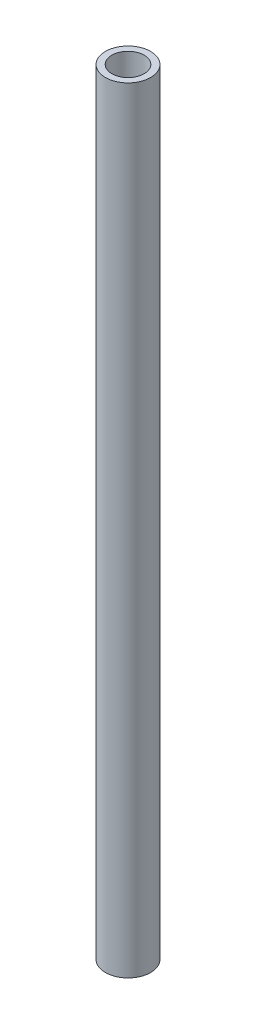
ISO-10303-21;
HEADER;
FILE_DESCRIPTION(('STEP AP214'),'2;1');
FILE_NAME('part.step','',(''),(''),'','','');
FILE_SCHEMA(('AUTOMOTIVE_DESIGN { 1 0 10303 214 1 1 1 1 }'));
ENDSEC;
DATA;
#1=APPLICATION_CONTEXT('core data for automotive mechanical design processes');
#2=APPLICATION_PROTOCOL_DEFINITION('international standard','automotive_design',2000,#1);
#3=PRODUCT_CONTEXT('',#1,'mechanical');
#4=PRODUCT('Part','Part','',(#3));
#5=PRODUCT_RELATED_PRODUCT_CATEGORY('part','',(#4));
#6=PRODUCT_DEFINITION_FORMATION('','',#4);
#7=PRODUCT_DEFINITION_CONTEXT('part definition',#1,'design');
#8=PRODUCT_DEFINITION('design','',#6,#7);
#9=PRODUCT_DEFINITION_SHAPE('','',#8);
#10=(LENGTH_UNIT() NAMED_UNIT(*) SI_UNIT(.MILLI.,.METRE.));
#11=(NAMED_UNIT(*) PLANE_ANGLE_UNIT() SI_UNIT($,.RADIAN.));
#12=(NAMED_UNIT(*) SI_UNIT($,.STERADIAN.) SOLID_ANGLE_UNIT());
#13=UNCERTAINTY_MEASURE_WITH_UNIT(LENGTH_MEASURE(1.E-05),#10,'distance_accuracy_value','');
#14=(GEOMETRIC_REPRESENTATION_CONTEXT(3) GLOBAL_UNCERTAINTY_ASSIGNED_CONTEXT((#13)) GLOBAL_UNIT_ASSIGNED_CONTEXT((#10,
#11,#12)) REPRESENTATION_CONTEXT('',''));
#15=CARTESIAN_POINT('',(0.,0.,0.));
#16=DIRECTION('',(0.,0.,1.));
#17=DIRECTION('',(1.,0.,0.));
#18=AXIS2_PLACEMENT_3D('',#15,#16,#17);
#19=CARTESIAN_POINT('',(2.50000000000002,60.,0.));
#20=DIRECTION('',(0.,1.,0.));
#21=DIRECTION('',(0.,0.,1.));
#22=AXIS2_PLACEMENT_3D('',#19,#20,#21);
#23=PLANE('',#22);
#24=CARTESIAN_POINT('',(0.,60.,0.));
#25=DIRECTION('',(0.,-1.,0.));
#26=DIRECTION('',(0.,0.,-1.));
#27=AXIS2_PLACEMENT_3D('',#24,#25,#26);
#28=CIRCLE('',#27,2.50000000000002);
#29=CARTESIAN_POINT('',(0.,60.,-2.50000000000002));
#30=VERTEX_POINT('',#29);
#31=EDGE_CURVE('E55',#30,#30,#28,.T.);
#32=ORIENTED_EDGE('',*,*,#31,.T.);
#33=EDGE_LOOP('',(#32));
#34=FACE_BOUND('',#33,.T.);
#35=CARTESIAN_POINT('',(0.,60.,0.));
#36=DIRECTION('',(0.,-1.,0.));
#37=DIRECTION('',(0.,0.,-1.));
#38=AXIS2_PLACEMENT_3D('',#35,#36,#37);
#39=CIRCLE('',#38,3.50000000000002);
#40=CARTESIAN_POINT('',(0.,60.,-3.50000000000002));
#41=VERTEX_POINT('',#40);
#42=EDGE_CURVE('E12',#41,#41,#39,.T.);
#43=ORIENTED_EDGE('',*,*,#42,.F.);
#44=EDGE_LOOP('',(#43));
#45=FACE_BOUND('',#44,.T.);
#46=ADVANCED_FACE('F41',(#34,#45),#23,.T.);
#47=CARTESIAN_POINT('',(0.,-84.5864661654135,0.));
#48=DIRECTION('',(0.,-1.,0.));
#49=DIRECTION('',(0.,0.,-1.));
#50=AXIS2_PLACEMENT_3D('',#47,#48,#49);
#51=CYLINDRICAL_SURFACE('',#50,3.50000000000002);
#52=ORIENTED_EDGE('',*,*,#42,.T.);
#53=EDGE_LOOP('',(#52));
#54=FACE_BOUND('',#53,.T.);
#55=CARTESIAN_POINT('',(0.,-60.,0.));
#56=DIRECTION('',(0.,-1.,0.));
#57=DIRECTION('',(0.,0.,-1.));
#58=AXIS2_PLACEMENT_3D('',#55,#56,#57);
#59=CIRCLE('',#58,3.50000000000002);
#60=CARTESIAN_POINT('',(0.,-60.,-3.50000000000002));
#61=VERTEX_POINT('',#60);
#62=EDGE_CURVE('E47',#61,#61,#59,.T.);
#63=ORIENTED_EDGE('',*,*,#62,.F.);
#64=EDGE_LOOP('',(#63));
#65=FACE_BOUND('',#64,.T.);
#66=ADVANCED_FACE('F71',(#54,#65),#51,.T.);
#67=CARTESIAN_POINT('',(3.50000000000002,-60.,0.));
#68=DIRECTION('',(0.,-1.,0.));
#69=DIRECTION('',(0.,0.,-1.));
#70=AXIS2_PLACEMENT_3D('',#67,#68,#69);
#71=PLANE('',#70);
#72=ORIENTED_EDGE('',*,*,#62,.T.);
#73=EDGE_LOOP('',(#72));
#74=FACE_BOUND('',#73,.T.);
#75=CARTESIAN_POINT('',(0.,-60.,0.));
#76=DIRECTION('',(0.,-1.,0.));
#77=DIRECTION('',(0.,0.,-1.));
#78=AXIS2_PLACEMENT_3D('',#75,#76,#77);
#79=CIRCLE('',#78,2.50000000000002);
#80=CARTESIAN_POINT('',(0.,-60.,-2.50000000000002));
#81=VERTEX_POINT('',#80);
#82=EDGE_CURVE('E51',#81,#81,#79,.T.);
#83=ORIENTED_EDGE('',*,*,#82,.F.);
#84=EDGE_LOOP('',(#83));
#85=FACE_BOUND('',#84,.T.);
#86=ADVANCED_FACE('F65',(#74,#85),#71,.T.);
#87=CARTESIAN_POINT('',(0.,-84.5864661654135,0.));
#88=DIRECTION('',(0.,-1.,0.));
#89=DIRECTION('',(0.,0.,-1.));
#90=AXIS2_PLACEMENT_3D('',#87,#88,#89);
#91=CYLINDRICAL_SURFACE('',#90,2.50000000000002);
#92=ORIENTED_EDGE('',*,*,#82,.T.);
#93=EDGE_LOOP('',(#92));
#94=FACE_BOUND('',#93,.T.);
#95=ORIENTED_EDGE('',*,*,#31,.F.);
#96=EDGE_LOOP('',(#95));
#97=FACE_BOUND('',#96,.T.);
#98=ADVANCED_FACE('F63',(#94,#97),#91,.F.);
#99=CLOSED_SHELL('',(#46,#66,#86,#98));
#100=MANIFOLD_SOLID_BREP('B2',#99);
#101=ADVANCED_BREP_SHAPE_REPRESENTATION('',(#18,#100),#14);
#102=SHAPE_DEFINITION_REPRESENTATION(#9,#101);
ENDSEC;
END-ISO-10303-21;
